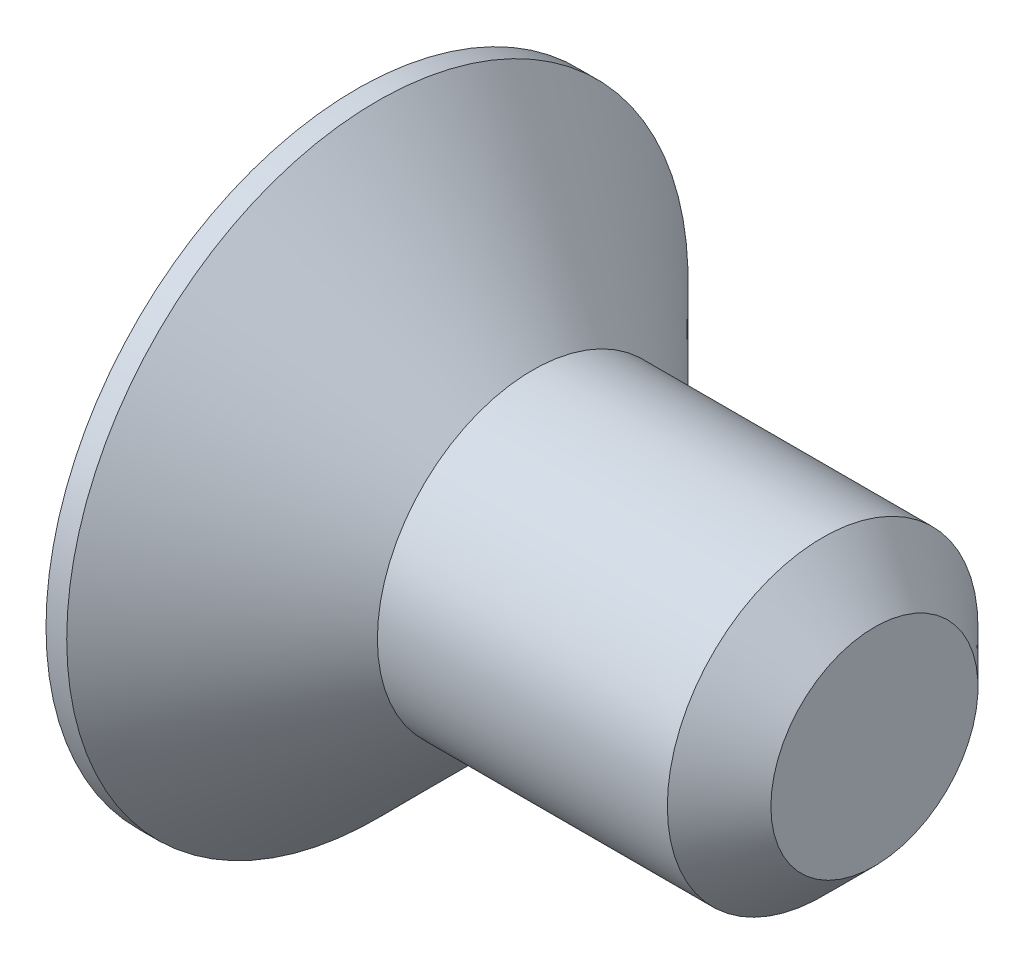
ISO-10303-21;
HEADER;
FILE_DESCRIPTION(('STEP AP214'),'2;1');
FILE_NAME('part.step','',(''),(''),'','','');
FILE_SCHEMA(('AUTOMOTIVE_DESIGN { 1 0 10303 214 1 1 1 1 }'));
ENDSEC;
DATA;
#1=APPLICATION_CONTEXT('core data for automotive mechanical design processes');
#2=APPLICATION_PROTOCOL_DEFINITION('international standard','automotive_design',2000,#1);
#3=PRODUCT_CONTEXT('',#1,'mechanical');
#4=PRODUCT('Part','Part','',(#3));
#5=PRODUCT_RELATED_PRODUCT_CATEGORY('part','',(#4));
#6=PRODUCT_DEFINITION_FORMATION('','',#4);
#7=PRODUCT_DEFINITION_CONTEXT('part definition',#1,'design');
#8=PRODUCT_DEFINITION('design','',#6,#7);
#9=PRODUCT_DEFINITION_SHAPE('','',#8);
#10=(LENGTH_UNIT() NAMED_UNIT(*) SI_UNIT(.MILLI.,.METRE.));
#11=(NAMED_UNIT(*) PLANE_ANGLE_UNIT() SI_UNIT($,.RADIAN.));
#12=(NAMED_UNIT(*) SI_UNIT($,.STERADIAN.) SOLID_ANGLE_UNIT());
#13=UNCERTAINTY_MEASURE_WITH_UNIT(LENGTH_MEASURE(1.E-05),#10,'distance_accuracy_value','');
#14=(GEOMETRIC_REPRESENTATION_CONTEXT(3) GLOBAL_UNCERTAINTY_ASSIGNED_CONTEXT((#13)) GLOBAL_UNIT_ASSIGNED_CONTEXT((#10,
#11,#12)) REPRESENTATION_CONTEXT('',''));
#15=CARTESIAN_POINT('',(0.,0.,0.));
#16=DIRECTION('',(0.,0.,1.));
#17=DIRECTION('',(1.,0.,0.));
#18=AXIS2_PLACEMENT_3D('',#15,#16,#17);
#19=CARTESIAN_POINT('',(-1.7,-3.,0.));
#20=DIRECTION('',(-1.,0.,0.));
#21=DIRECTION('',(0.,0.,1.));
#22=AXIS2_PLACEMENT_3D('',#19,#20,#21);
#23=PLANE('',#22);
#24=DIRECTION('',(0.,0.5,-0.866025403784439));
#25=VECTOR('',#24,1.);
#26=CARTESIAN_POINT('',(-1.7,0.577350269189627,0.999999999999999));
#27=LINE('',#26,#25);
#28=CARTESIAN_POINT('',(-1.7,0.577350269189627,0.999999999999999));
#29=VERTEX_POINT('',#28);
#30=CARTESIAN_POINT('',(-1.7,1.15470053837925,0.));
#31=VERTEX_POINT('',#30);
#32=EDGE_CURVE('E61',#29,#31,#27,.T.);
#33=ORIENTED_EDGE('',*,*,#32,.F.);
#34=DIRECTION('',(0.,1.,0.));
#35=VECTOR('',#34,1.);
#36=CARTESIAN_POINT('',(-1.7,-0.577350269189626,0.999999999999999));
#37=LINE('',#36,#35);
#38=CARTESIAN_POINT('',(-1.7,-0.577350269189626,0.999999999999999));
#39=VERTEX_POINT('',#38);
#40=EDGE_CURVE('E155',#39,#29,#37,.T.);
#41=ORIENTED_EDGE('',*,*,#40,.F.);
#42=DIRECTION('',(0.,0.5,0.866025403784439));
#43=VECTOR('',#42,1.);
#44=CARTESIAN_POINT('',(-1.7,-1.15470053837925,0.));
#45=LINE('',#44,#43);
#46=CARTESIAN_POINT('',(-1.7,-1.15470053837925,0.));
#47=VERTEX_POINT('',#46);
#48=EDGE_CURVE('E152',#47,#39,#45,.T.);
#49=ORIENTED_EDGE('',*,*,#48,.F.);
#50=DIRECTION('',(0.,-0.5,0.866025403784438));
#51=VECTOR('',#50,1.);
#52=CARTESIAN_POINT('',(-1.7,-0.577350269189626,-1.));
#53=LINE('',#52,#51);
#54=CARTESIAN_POINT('',(-1.7,-0.577350269189626,-1.));
#55=VERTEX_POINT('',#54);
#56=EDGE_CURVE('E109',#55,#47,#53,.T.);
#57=ORIENTED_EDGE('',*,*,#56,.F.);
#58=DIRECTION('',(0.,-1.,0.));
#59=VECTOR('',#58,1.);
#60=CARTESIAN_POINT('',(-1.7,0.577350269189626,-1.));
#61=LINE('',#60,#59);
#62=CARTESIAN_POINT('',(-1.7,0.577350269189626,-1.));
#63=VERTEX_POINT('',#62);
#64=EDGE_CURVE('E146',#63,#55,#61,.T.);
#65=ORIENTED_EDGE('',*,*,#64,.F.);
#66=DIRECTION('',(0.,-0.5,-0.866025403784439));
#67=VECTOR('',#66,1.);
#68=CARTESIAN_POINT('',(-1.7,1.15470053837925,0.));
#69=LINE('',#68,#67);
#70=EDGE_CURVE('E142',#31,#63,#69,.T.);
#71=ORIENTED_EDGE('',*,*,#70,.F.);
#72=EDGE_LOOP('',(#33,#41,#49,#57,#65,#71));
#73=FACE_BOUND('',#72,.T.);
#74=CARTESIAN_POINT('',(-1.7,0.,0.));
#75=DIRECTION('',(-1.,0.,0.));
#76=DIRECTION('',(0.,0.,1.));
#77=AXIS2_PLACEMENT_3D('',#74,#75,#76);
#78=CIRCLE('',#77,3.);
#79=CARTESIAN_POINT('',(-1.7,0.,3.));
#80=VERTEX_POINT('',#79);
#81=EDGE_CURVE('E11',#80,#80,#78,.T.);
#82=ORIENTED_EDGE('',*,*,#81,.T.);
#83=EDGE_LOOP('',(#82));
#84=FACE_BOUND('',#83,.T.);
#85=ADVANCED_FACE('F46',(#73,#84),#23,.T.);
#86=CARTESIAN_POINT('',(-1.7,0.,0.));
#87=DIRECTION('',(-1.,0.,0.));
#88=DIRECTION('',(0.,0.,1.));
#89=AXIS2_PLACEMENT_3D('',#86,#87,#88);
#90=CYLINDRICAL_SURFACE('',#89,3.);
#91=CARTESIAN_POINT('',(-1.5,0.,0.));
#92=DIRECTION('',(-1.,0.,0.));
#93=DIRECTION('',(0.,0.,1.));
#94=AXIS2_PLACEMENT_3D('',#91,#92,#93);
#95=CIRCLE('',#94,3.);
#96=CARTESIAN_POINT('',(-1.5,0.,3.));
#97=VERTEX_POINT('',#96);
#98=EDGE_CURVE('E54',#97,#97,#95,.T.);
#99=ORIENTED_EDGE('',*,*,#98,.T.);
#100=EDGE_LOOP('',(#99));
#101=FACE_BOUND('',#100,.T.);
#102=ORIENTED_EDGE('',*,*,#81,.F.);
#103=EDGE_LOOP('',(#102));
#104=FACE_BOUND('',#103,.T.);
#105=ADVANCED_FACE('F186',(#101,#104),#90,.T.);
#106=CARTESIAN_POINT('',(-1.5,0.,0.));
#107=DIRECTION('',(-1.,0.,0.));
#108=DIRECTION('',(0.,0.,1.));
#109=AXIS2_PLACEMENT_3D('',#106,#107,#108);
#110=CONICAL_SURFACE('',#109,3.,0.785398163397448);
#111=CARTESIAN_POINT('',(0.,0.,0.));
#112=DIRECTION('',(-1.,0.,0.));
#113=DIRECTION('',(0.,0.,1.));
#114=AXIS2_PLACEMENT_3D('',#111,#112,#113);
#115=CIRCLE('',#114,1.5);
#116=CARTESIAN_POINT('',(0.,0.,1.5));
#117=VERTEX_POINT('',#116);
#118=EDGE_CURVE('E178',#117,#117,#115,.T.);
#119=ORIENTED_EDGE('',*,*,#118,.T.);
#120=EDGE_LOOP('',(#119));
#121=FACE_BOUND('',#120,.T.);
#122=ORIENTED_EDGE('',*,*,#98,.F.);
#123=EDGE_LOOP('',(#122));
#124=FACE_BOUND('',#123,.T.);
#125=ADVANCED_FACE('F189',(#121,#124),#110,.T.);
#126=CARTESIAN_POINT('',(-1.7,0.,0.));
#127=DIRECTION('',(-1.,0.,0.));
#128=DIRECTION('',(0.,0.,1.));
#129=AXIS2_PLACEMENT_3D('',#126,#127,#128);
#130=CYLINDRICAL_SURFACE('',#129,1.5);
#131=CARTESIAN_POINT('',(2.8,0.,0.));
#132=DIRECTION('',(-1.,0.,0.));
#133=DIRECTION('',(0.,0.,1.));
#134=AXIS2_PLACEMENT_3D('',#131,#132,#133);
#135=CIRCLE('',#134,1.5);
#136=CARTESIAN_POINT('',(2.8,0.,1.5));
#137=VERTEX_POINT('',#136);
#138=EDGE_CURVE('E174',#137,#137,#135,.T.);
#139=ORIENTED_EDGE('',*,*,#138,.T.);
#140=EDGE_LOOP('',(#139));
#141=FACE_BOUND('',#140,.T.);
#142=ORIENTED_EDGE('',*,*,#118,.F.);
#143=EDGE_LOOP('',(#142));
#144=FACE_BOUND('',#143,.T.);
#145=ADVANCED_FACE('F191',(#141,#144),#130,.T.);
#146=CARTESIAN_POINT('',(2.8,0.,0.));
#147=DIRECTION('',(-1.,0.,0.));
#148=DIRECTION('',(0.,0.,1.));
#149=AXIS2_PLACEMENT_3D('',#146,#147,#148);
#150=CONICAL_SURFACE('',#149,1.5,0.785398163397446);
#151=CARTESIAN_POINT('',(3.3,0.,0.));
#152=DIRECTION('',(-1.,0.,0.));
#153=DIRECTION('',(0.,0.,1.));
#154=AXIS2_PLACEMENT_3D('',#151,#152,#153);
#155=CIRCLE('',#154,1.);
#156=CARTESIAN_POINT('',(3.3,0.,1.));
#157=VERTEX_POINT('',#156);
#158=EDGE_CURVE('E161',#157,#157,#155,.T.);
#159=ORIENTED_EDGE('',*,*,#158,.T.);
#160=EDGE_LOOP('',(#159));
#161=FACE_BOUND('',#160,.T.);
#162=ORIENTED_EDGE('',*,*,#138,.F.);
#163=EDGE_LOOP('',(#162));
#164=FACE_BOUND('',#163,.T.);
#165=ADVANCED_FACE('F198',(#161,#164),#150,.T.);
#166=CARTESIAN_POINT('',(3.3,-1.,0.));
#167=DIRECTION('',(1.,0.,0.));
#168=DIRECTION('',(0.,0.,-1.));
#169=AXIS2_PLACEMENT_3D('',#166,#167,#168);
#170=PLANE('',#169);
#171=ORIENTED_EDGE('',*,*,#158,.F.);
#172=EDGE_LOOP('',(#171));
#173=FACE_BOUND('',#172,.T.);
#174=ADVANCED_FACE('F227',(#173),#170,.T.);
#175=CARTESIAN_POINT('',(-0.6,0.577350269189627,0.999999999999999));
#176=DIRECTION('',(0.,0.866025403784438,0.5));
#177=DIRECTION('',(0.,-0.5,0.866025403784439));
#178=AXIS2_PLACEMENT_3D('',#175,#176,#177);
#179=PLANE('',#178);
#180=ORIENTED_EDGE('',*,*,#32,.T.);
#181=DIRECTION('',(-1.,0.,0.));
#182=VECTOR('',#181,1.);
#183=CARTESIAN_POINT('',(-0.6,1.15470053837925,0.));
#184=LINE('',#183,#182);
#185=CARTESIAN_POINT('',(-0.6,1.15470053837925,0.));
#186=VERTEX_POINT('',#185);
#187=EDGE_CURVE('E91',#186,#31,#184,.T.);
#188=ORIENTED_EDGE('',*,*,#187,.F.);
#189=DIRECTION('',(0.,0.5,-0.866025403784439));
#190=VECTOR('',#189,1.);
#191=CARTESIAN_POINT('',(-0.6,0.577350269189627,0.999999999999999));
#192=LINE('',#191,#190);
#193=CARTESIAN_POINT('',(-0.6,0.577350269189627,0.999999999999999));
#194=VERTEX_POINT('',#193);
#195=EDGE_CURVE('E158',#194,#186,#192,.T.);
#196=ORIENTED_EDGE('',*,*,#195,.F.);
#197=DIRECTION('',(-1.,0.,0.));
#198=VECTOR('',#197,1.);
#199=CARTESIAN_POINT('',(-0.6,0.577350269189627,0.999999999999999));
#200=LINE('',#199,#198);
#201=EDGE_CURVE('E69',#194,#29,#200,.T.);
#202=ORIENTED_EDGE('',*,*,#201,.T.);
#203=EDGE_LOOP('',(#180,#188,#196,#202));
#204=FACE_BOUND('',#203,.T.);
#205=ADVANCED_FACE('F224',(#204),#179,.F.);
#206=CARTESIAN_POINT('',(-0.6,-0.577350269189626,0.999999999999999));
#207=DIRECTION('',(0.,0.,1.));
#208=DIRECTION('',(1.,0.,0.));
#209=AXIS2_PLACEMENT_3D('',#206,#207,#208);
#210=PLANE('',#209);
#211=ORIENTED_EDGE('',*,*,#40,.T.);
#212=ORIENTED_EDGE('',*,*,#201,.F.);
#213=DIRECTION('',(0.,1.,0.));
#214=VECTOR('',#213,1.);
#215=CARTESIAN_POINT('',(-0.6,-0.577350269189626,0.999999999999999));
#216=LINE('',#215,#214);
#217=CARTESIAN_POINT('',(-0.6,-0.577350269189626,0.999999999999999));
#218=VERTEX_POINT('',#217);
#219=EDGE_CURVE('E123',#218,#194,#216,.T.);
#220=ORIENTED_EDGE('',*,*,#219,.F.);
#221=DIRECTION('',(-1.,0.,0.));
#222=VECTOR('',#221,1.);
#223=CARTESIAN_POINT('',(-0.6,-0.577350269189626,0.999999999999999));
#224=LINE('',#223,#222);
#225=EDGE_CURVE('E114',#218,#39,#224,.T.);
#226=ORIENTED_EDGE('',*,*,#225,.T.);
#227=EDGE_LOOP('',(#211,#212,#220,#226));
#228=FACE_BOUND('',#227,.T.);
#229=ADVANCED_FACE('F226',(#228),#210,.F.);
#230=CARTESIAN_POINT('',(-0.6,-1.15470053837925,0.));
#231=DIRECTION('',(0.,-0.866025403784439,0.5));
#232=DIRECTION('',(0.,-0.5,-0.866025403784439));
#233=AXIS2_PLACEMENT_3D('',#230,#231,#232);
#234=PLANE('',#233);
#235=ORIENTED_EDGE('',*,*,#48,.T.);
#236=ORIENTED_EDGE('',*,*,#225,.F.);
#237=DIRECTION('',(0.,0.5,0.866025403784439));
#238=VECTOR('',#237,1.);
#239=CARTESIAN_POINT('',(-0.6,-1.15470053837925,0.));
#240=LINE('',#239,#238);
#241=CARTESIAN_POINT('',(-0.6,-1.15470053837925,0.));
#242=VERTEX_POINT('',#241);
#243=EDGE_CURVE('E118',#242,#218,#240,.T.);
#244=ORIENTED_EDGE('',*,*,#243,.F.);
#245=DIRECTION('',(-1.,0.,0.));
#246=VECTOR('',#245,1.);
#247=CARTESIAN_POINT('',(-0.6,-1.15470053837925,0.));
#248=LINE('',#247,#246);
#249=EDGE_CURVE('E102',#242,#47,#248,.T.);
#250=ORIENTED_EDGE('',*,*,#249,.T.);
#251=EDGE_LOOP('',(#235,#236,#244,#250));
#252=FACE_BOUND('',#251,.T.);
#253=ADVANCED_FACE('F119',(#252),#234,.F.);
#254=CARTESIAN_POINT('',(-0.6,-0.577350269189626,-1.));
#255=DIRECTION('',(0.,-0.866025403784438,-0.5));
#256=DIRECTION('',(0.,0.5,-0.866025403784439));
#257=AXIS2_PLACEMENT_3D('',#254,#255,#256);
#258=PLANE('',#257);
#259=ORIENTED_EDGE('',*,*,#56,.T.);
#260=ORIENTED_EDGE('',*,*,#249,.F.);
#261=DIRECTION('',(0.,-0.5,0.866025403784438));
#262=VECTOR('',#261,1.);
#263=CARTESIAN_POINT('',(-0.6,-0.577350269189626,-1.));
#264=LINE('',#263,#262);
#265=CARTESIAN_POINT('',(-0.6,-0.577350269189626,-1.));
#266=VERTEX_POINT('',#265);
#267=EDGE_CURVE('E106',#266,#242,#264,.T.);
#268=ORIENTED_EDGE('',*,*,#267,.F.);
#269=DIRECTION('',(-1.,0.,0.));
#270=VECTOR('',#269,1.);
#271=CARTESIAN_POINT('',(-0.6,-0.577350269189626,-1.));
#272=LINE('',#271,#270);
#273=EDGE_CURVE('E115',#266,#55,#272,.T.);
#274=ORIENTED_EDGE('',*,*,#273,.T.);
#275=EDGE_LOOP('',(#259,#260,#268,#274));
#276=FACE_BOUND('',#275,.T.);
#277=ADVANCED_FACE('F104',(#276),#258,.F.);
#278=CARTESIAN_POINT('',(-0.6,0.577350269189626,-1.));
#279=DIRECTION('',(0.,0.,-1.));
#280=DIRECTION('',(-1.,0.,0.));
#281=AXIS2_PLACEMENT_3D('',#278,#279,#280);
#282=PLANE('',#281);
#283=ORIENTED_EDGE('',*,*,#64,.T.);
#284=ORIENTED_EDGE('',*,*,#273,.F.);
#285=DIRECTION('',(0.,-1.,0.));
#286=VECTOR('',#285,1.);
#287=CARTESIAN_POINT('',(-0.6,0.577350269189626,-1.));
#288=LINE('',#287,#286);
#289=CARTESIAN_POINT('',(-0.6,0.577350269189626,-1.));
#290=VERTEX_POINT('',#289);
#291=EDGE_CURVE('E129',#290,#266,#288,.T.);
#292=ORIENTED_EDGE('',*,*,#291,.F.);
#293=DIRECTION('',(-1.,0.,0.));
#294=VECTOR('',#293,1.);
#295=CARTESIAN_POINT('',(-0.6,0.577350269189626,-1.));
#296=LINE('',#295,#294);
#297=EDGE_CURVE('E166',#290,#63,#296,.T.);
#298=ORIENTED_EDGE('',*,*,#297,.T.);
#299=EDGE_LOOP('',(#283,#284,#292,#298));
#300=FACE_BOUND('',#299,.T.);
#301=ADVANCED_FACE('F271',(#300),#282,.F.);
#302=CARTESIAN_POINT('',(-0.6,1.15470053837925,0.));
#303=DIRECTION('',(0.,0.866025403784439,-0.5));
#304=DIRECTION('',(0.,0.5,0.866025403784439));
#305=AXIS2_PLACEMENT_3D('',#302,#303,#304);
#306=PLANE('',#305);
#307=ORIENTED_EDGE('',*,*,#70,.T.);
#308=ORIENTED_EDGE('',*,*,#297,.F.);
#309=DIRECTION('',(0.,-0.5,-0.866025403784439));
#310=VECTOR('',#309,1.);
#311=CARTESIAN_POINT('',(-0.6,1.15470053837925,0.));
#312=LINE('',#311,#310);
#313=EDGE_CURVE('E134',#186,#290,#312,.T.);
#314=ORIENTED_EDGE('',*,*,#313,.F.);
#315=ORIENTED_EDGE('',*,*,#187,.T.);
#316=EDGE_LOOP('',(#307,#308,#314,#315));
#317=FACE_BOUND('',#316,.T.);
#318=ADVANCED_FACE('F211',(#317),#306,.F.);
#319=CARTESIAN_POINT('',(-0.6,0.,0.));
#320=DIRECTION('',(-1.,0.,0.));
#321=DIRECTION('',(0.,0.,1.));
#322=AXIS2_PLACEMENT_3D('',#319,#320,#321);
#323=PLANE('',#322);
#324=ORIENTED_EDGE('',*,*,#195,.T.);
#325=ORIENTED_EDGE('',*,*,#313,.T.);
#326=ORIENTED_EDGE('',*,*,#291,.T.);
#327=ORIENTED_EDGE('',*,*,#267,.T.);
#328=ORIENTED_EDGE('',*,*,#243,.T.);
#329=ORIENTED_EDGE('',*,*,#219,.T.);
#330=EDGE_LOOP('',(#324,#325,#326,#327,#328,#329));
#331=FACE_BOUND('',#330,.T.);
#332=ADVANCED_FACE('F126',(#331),#323,.T.);
#333=CLOSED_SHELL('',(#85,#105,#125,#145,#165,#174,#205,#229,#253,#277,#301,#318,#332));
#334=MANIFOLD_SOLID_BREP('B2',#333);
#335=ADVANCED_BREP_SHAPE_REPRESENTATION('',(#18,#334),#14);
#336=SHAPE_DEFINITION_REPRESENTATION(#9,#335);
ENDSEC;
END-ISO-10303-21;
